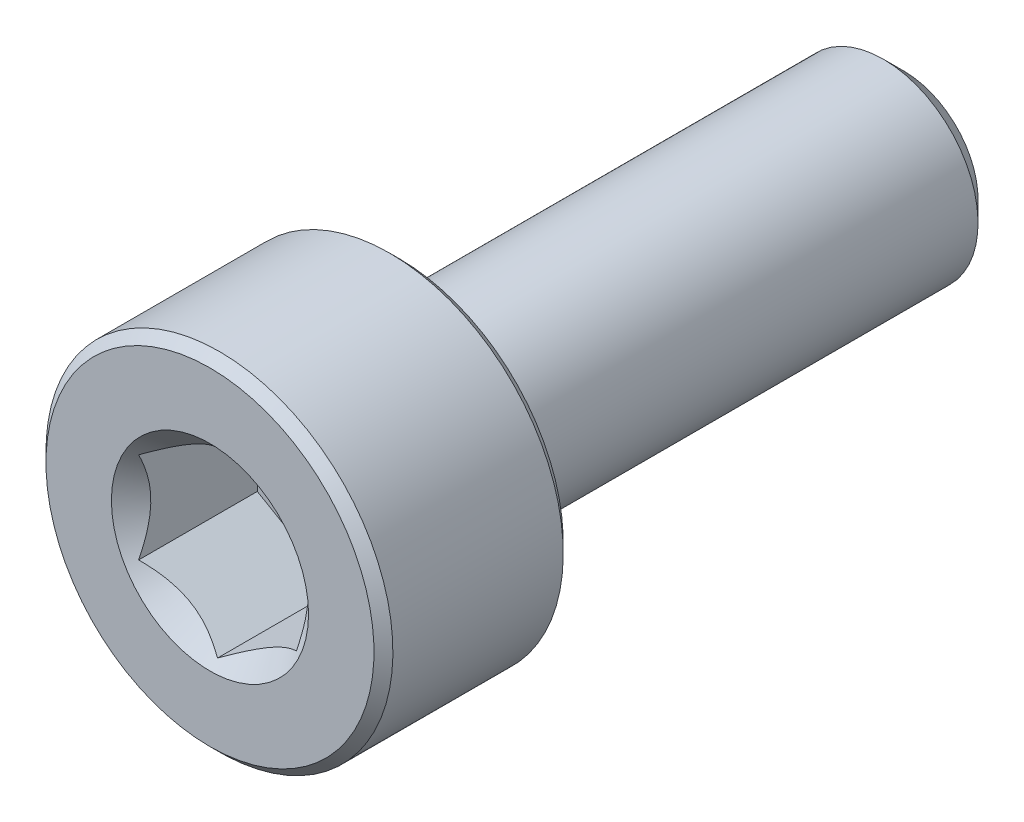
ISO-10303-21;
HEADER;
FILE_DESCRIPTION(('STEP AP214'),'2;1');
FILE_NAME('part.step','',(''),(''),'','','');
FILE_SCHEMA(('AUTOMOTIVE_DESIGN { 1 0 10303 214 1 1 1 1 }'));
ENDSEC;
DATA;
#1=APPLICATION_CONTEXT('core data for automotive mechanical design processes');
#2=APPLICATION_PROTOCOL_DEFINITION('international standard','automotive_design',2000,#1);
#3=PRODUCT_CONTEXT('',#1,'mechanical');
#4=PRODUCT('Part','Part','',(#3));
#5=PRODUCT_RELATED_PRODUCT_CATEGORY('part','',(#4));
#6=PRODUCT_DEFINITION_FORMATION('','',#4);
#7=PRODUCT_DEFINITION_CONTEXT('part definition',#1,'design');
#8=PRODUCT_DEFINITION('design','',#6,#7);
#9=PRODUCT_DEFINITION_SHAPE('','',#8);
#10=(LENGTH_UNIT() NAMED_UNIT(*) SI_UNIT(.MILLI.,.METRE.));
#11=(NAMED_UNIT(*) PLANE_ANGLE_UNIT() SI_UNIT($,.RADIAN.));
#12=(NAMED_UNIT(*) SI_UNIT($,.STERADIAN.) SOLID_ANGLE_UNIT());
#13=UNCERTAINTY_MEASURE_WITH_UNIT(LENGTH_MEASURE(1.E-05),#10,'distance_accuracy_value','');
#14=(GEOMETRIC_REPRESENTATION_CONTEXT(3) GLOBAL_UNCERTAINTY_ASSIGNED_CONTEXT((#13)) GLOBAL_UNIT_ASSIGNED_CONTEXT((#10,
#11,#12)) REPRESENTATION_CONTEXT('',''));
#15=CARTESIAN_POINT('',(0.,0.,0.));
#16=DIRECTION('',(0.,0.,1.));
#17=DIRECTION('',(1.,0.,0.));
#18=AXIS2_PLACEMENT_3D('',#15,#16,#17);
#19=CARTESIAN_POINT('',(0.,1.17524047358084,-5.5));
#20=DIRECTION('',(0.,0.,-1.));
#21=DIRECTION('',(0.,1.,0.));
#22=AXIS2_PLACEMENT_3D('',#19,#20,#21);
#23=PLANE('',#22);
#24=CARTESIAN_POINT('',(0.,0.,-5.5));
#25=DIRECTION('',(0.,0.,-1.));
#26=DIRECTION('',(0.,1.,0.));
#27=AXIS2_PLACEMENT_3D('',#24,#25,#26);
#28=CIRCLE('',#27,1.17524047358084);
#29=CARTESIAN_POINT('',(0.,1.17524047358084,-5.5));
#30=VERTEX_POINT('',#29);
#31=EDGE_CURVE('E52',#30,#30,#28,.T.);
#32=ORIENTED_EDGE('',*,*,#31,.T.);
#33=EDGE_LOOP('',(#32));
#34=FACE_BOUND('',#33,.T.);
#35=ADVANCED_FACE('F39',(#34),#23,.T.);
#36=CARTESIAN_POINT('',(0.,0.,-5.5));
#37=DIRECTION('',(0.,0.,1.));
#38=DIRECTION('',(0.,-1.,0.));
#39=AXIS2_PLACEMENT_3D('',#36,#37,#38);
#40=CONICAL_SURFACE('',#39,1.17524047358084,0.785398163397445);
#41=CARTESIAN_POINT('',(0.,0.,-5.17524047358083));
#42=DIRECTION('',(0.,0.,-1.));
#43=DIRECTION('',(0.,1.,0.));
#44=AXIS2_PLACEMENT_3D('',#41,#42,#43);
#45=CIRCLE('',#44,1.5);
#46=CARTESIAN_POINT('',(0.,1.5,-5.17524047358083));
#47=VERTEX_POINT('',#46);
#48=EDGE_CURVE('E155',#47,#47,#45,.T.);
#49=ORIENTED_EDGE('',*,*,#48,.T.);
#50=EDGE_LOOP('',(#49));
#51=FACE_BOUND('',#50,.T.);
#52=ORIENTED_EDGE('',*,*,#31,.F.);
#53=EDGE_LOOP('',(#52));
#54=FACE_BOUND('',#53,.T.);
#55=ADVANCED_FACE('F161',(#51,#54),#40,.T.);
#56=CARTESIAN_POINT('',(0.,0.,-5.5));
#57=DIRECTION('',(0.,0.,-1.));
#58=DIRECTION('',(0.,1.,0.));
#59=AXIS2_PLACEMENT_3D('',#56,#57,#58);
#60=CYLINDRICAL_SURFACE('',#59,1.5);
#61=CARTESIAN_POINT('',(0.,0.,2.35));
#62=DIRECTION('',(0.,0.,-1.));
#63=DIRECTION('',(0.,1.,0.));
#64=AXIS2_PLACEMENT_3D('',#61,#62,#63);
#65=CIRCLE('',#64,1.5);
#66=CARTESIAN_POINT('',(0.,1.5,2.35));
#67=VERTEX_POINT('',#66);
#68=EDGE_CURVE('E152',#67,#67,#65,.T.);
#69=ORIENTED_EDGE('',*,*,#68,.T.);
#70=EDGE_LOOP('',(#69));
#71=FACE_BOUND('',#70,.T.);
#72=ORIENTED_EDGE('',*,*,#48,.F.);
#73=EDGE_LOOP('',(#72));
#74=FACE_BOUND('',#73,.T.);
#75=ADVANCED_FACE('F163',(#71,#74),#60,.T.);
#76=CARTESIAN_POINT('',(0.,0.,2.35));
#77=DIRECTION('',(0.,0.,-1.));
#78=DIRECTION('',(0.,1.,0.));
#79=AXIS2_PLACEMENT_3D('',#76,#77,#78);
#80=TOROIDAL_SURFACE('',#79,1.65,0.15);
#81=CARTESIAN_POINT('',(0.,0.,2.5));
#82=DIRECTION('',(0.,0.,-1.));
#83=DIRECTION('',(0.,1.,0.));
#84=AXIS2_PLACEMENT_3D('',#81,#82,#83);
#85=CIRCLE('',#84,1.65);
#86=CARTESIAN_POINT('',(0.,1.65,2.5));
#87=VERTEX_POINT('',#86);
#88=EDGE_CURVE('E149',#87,#87,#85,.T.);
#89=ORIENTED_EDGE('',*,*,#88,.T.);
#90=EDGE_LOOP('',(#89));
#91=FACE_BOUND('',#90,.T.);
#92=ORIENTED_EDGE('',*,*,#68,.F.);
#93=EDGE_LOOP('',(#92));
#94=FACE_BOUND('',#93,.T.);
#95=ADVANCED_FACE('F169',(#91,#94),#80,.F.);
#96=CARTESIAN_POINT('',(0.,2.6,2.5));
#97=DIRECTION('',(0.,0.,-1.));
#98=DIRECTION('',(0.,1.,0.));
#99=AXIS2_PLACEMENT_3D('',#96,#97,#98);
#100=PLANE('',#99);
#101=CARTESIAN_POINT('',(0.,0.,2.5));
#102=DIRECTION('',(0.,0.,-1.));
#103=DIRECTION('',(0.,1.,0.));
#104=AXIS2_PLACEMENT_3D('',#101,#102,#103);
#105=CIRCLE('',#104,2.6);
#106=CARTESIAN_POINT('',(0.,2.6,2.5));
#107=VERTEX_POINT('',#106);
#108=EDGE_CURVE('E146',#107,#107,#105,.T.);
#109=ORIENTED_EDGE('',*,*,#108,.T.);
#110=EDGE_LOOP('',(#109));
#111=FACE_BOUND('',#110,.T.);
#112=ORIENTED_EDGE('',*,*,#88,.F.);
#113=EDGE_LOOP('',(#112));
#114=FACE_BOUND('',#113,.T.);
#115=ADVANCED_FACE('F175',(#111,#114),#100,.T.);
#116=CARTESIAN_POINT('',(0.,0.,2.5));
#117=DIRECTION('',(0.,0.,1.));
#118=DIRECTION('',(0.,-1.,0.));
#119=AXIS2_PLACEMENT_3D('',#116,#117,#118);
#120=CONICAL_SURFACE('',#119,2.6,0.785398163397445);
#121=CARTESIAN_POINT('',(0.,0.,2.65));
#122=DIRECTION('',(0.,0.,-1.));
#123=DIRECTION('',(0.,1.,0.));
#124=AXIS2_PLACEMENT_3D('',#121,#122,#123);
#125=CIRCLE('',#124,2.75);
#126=CARTESIAN_POINT('',(0.,2.75,2.65));
#127=VERTEX_POINT('',#126);
#128=EDGE_CURVE('E143',#127,#127,#125,.T.);
#129=ORIENTED_EDGE('',*,*,#128,.T.);
#130=EDGE_LOOP('',(#129));
#131=FACE_BOUND('',#130,.T.);
#132=ORIENTED_EDGE('',*,*,#108,.F.);
#133=EDGE_LOOP('',(#132));
#134=FACE_BOUND('',#133,.T.);
#135=ADVANCED_FACE('F179',(#131,#134),#120,.T.);
#136=CARTESIAN_POINT('',(0.,0.,-5.5));
#137=DIRECTION('',(0.,0.,-1.));
#138=DIRECTION('',(0.,1.,0.));
#139=AXIS2_PLACEMENT_3D('',#136,#137,#138);
#140=CYLINDRICAL_SURFACE('',#139,2.75);
#141=CARTESIAN_POINT('',(0.,0.,5.35));
#142=DIRECTION('',(0.,0.,-1.));
#143=DIRECTION('',(0.,1.,0.));
#144=AXIS2_PLACEMENT_3D('',#141,#142,#143);
#145=CIRCLE('',#144,2.75);
#146=CARTESIAN_POINT('',(0.,2.75,5.35));
#147=VERTEX_POINT('',#146);
#148=EDGE_CURVE('E140',#147,#147,#145,.T.);
#149=ORIENTED_EDGE('',*,*,#148,.T.);
#150=EDGE_LOOP('',(#149));
#151=FACE_BOUND('',#150,.T.);
#152=ORIENTED_EDGE('',*,*,#128,.F.);
#153=EDGE_LOOP('',(#152));
#154=FACE_BOUND('',#153,.T.);
#155=ADVANCED_FACE('F183',(#151,#154),#140,.T.);
#156=CARTESIAN_POINT('',(0.,0.,5.35));
#157=DIRECTION('',(0.,0.,-1.));
#158=DIRECTION('',(0.,1.,0.));
#159=AXIS2_PLACEMENT_3D('',#156,#157,#158);
#160=CONICAL_SURFACE('',#159,2.75,0.785398163397451);
#161=CARTESIAN_POINT('',(0.,0.,5.5));
#162=DIRECTION('',(0.,0.,-1.));
#163=DIRECTION('',(0.,1.,0.));
#164=AXIS2_PLACEMENT_3D('',#161,#162,#163);
#165=CIRCLE('',#164,2.6);
#166=CARTESIAN_POINT('',(0.,2.6,5.5));
#167=VERTEX_POINT('',#166);
#168=EDGE_CURVE('E137',#167,#167,#165,.T.);
#169=ORIENTED_EDGE('',*,*,#168,.T.);
#170=EDGE_LOOP('',(#169));
#171=FACE_BOUND('',#170,.T.);
#172=ORIENTED_EDGE('',*,*,#148,.F.);
#173=EDGE_LOOP('',(#172));
#174=FACE_BOUND('',#173,.T.);
#175=ADVANCED_FACE('F187',(#171,#174),#160,.T.);
#176=CARTESIAN_POINT('',(0.,0.,5.5));
#177=DIRECTION('',(0.,0.,1.));
#178=DIRECTION('',(0.,-1.,0.));
#179=AXIS2_PLACEMENT_3D('',#176,#177,#178);
#180=PLANE('',#179);
#181=CARTESIAN_POINT('',(0.,0.,5.5));
#182=DIRECTION('',(0.,0.,1.));
#183=DIRECTION('',(1.,0.,0.));
#184=AXIS2_PLACEMENT_3D('',#181,#182,#183);
#185=CIRCLE('',#184,1.5625);
#186=CARTESIAN_POINT('',(1.5625,0.,5.5));
#187=VERTEX_POINT('',#186);
#188=EDGE_CURVE('E111',#187,#187,#185,.T.);
#189=ORIENTED_EDGE('',*,*,#188,.F.);
#190=EDGE_LOOP('',(#189));
#191=FACE_BOUND('',#190,.T.);
#192=ORIENTED_EDGE('',*,*,#168,.F.);
#193=EDGE_LOOP('',(#192));
#194=FACE_BOUND('',#193,.T.);
#195=ADVANCED_FACE('F191',(#191,#194),#180,.T.);
#196=CARTESIAN_POINT('',(0.,0.,5.5));
#197=DIRECTION('',(0.,0.,1.));
#198=DIRECTION('',(1.,0.,0.));
#199=AXIS2_PLACEMENT_3D('',#196,#197,#198);
#200=CONICAL_SURFACE('',#199,1.5625,0.78539816339745);
#201=ORIENTED_EDGE('',*,*,#188,.T.);
#202=EDGE_LOOP('',(#201));
#203=FACE_BOUND('',#202,.T.);
#204=CARTESIAN_POINT('',(-0.000200000000000281,-1.4434911430279,5.3809911568832));
#205=CARTESIAN_POINT('',(0.0427751670715865,-1.41867941875065,5.35619734102917));
#206=CARTESIAN_POINT('',(0.0864690047459478,-1.39345276980743,5.33285940739275));
#207=CARTESIAN_POINT('',(0.175565930841942,-1.34201263554194,5.2901276770586));
#208=CARTESIAN_POINT('',(0.220977498357064,-1.31579425481276,5.27075766533448));
#209=CARTESIAN_POINT('',(0.31254782093526,-1.26292610442246,5.23757615638754));
#210=CARTESIAN_POINT('',(0.358683240175885,-1.23628980770471,5.22368123202672));
#211=CARTESIAN_POINT('',(0.451970080407592,-1.18243062538508,5.2022729551347));
#212=CARTESIAN_POINT('',(0.49911864913638,-1.15520938653761,5.19474361454085));
#213=CARTESIAN_POINT('',(0.580373556887252,-1.10829684367467,5.18795017102477));
#214=CARTESIAN_POINT('',(0.614374876627941,-1.08866617256958,5.18694423207841));
#215=CARTESIAN_POINT('',(0.682317764432477,-1.04943932800611,5.18863708788538));
#216=CARTESIAN_POINT('',(0.716259317655657,-1.02984316311599,5.1913367001896));
#217=CARTESIAN_POINT('',(0.783814856457499,-0.990839954603499,5.20028460329044));
#218=CARTESIAN_POINT('',(0.817428507286775,-0.971433104248771,5.20653619887377));
#219=CARTESIAN_POINT('',(0.884094638217813,-0.932943395609905,5.22225135438797));
#220=CARTESIAN_POINT('',(0.917146871030295,-0.9138606800983,5.23171629306152));
#221=CARTESIAN_POINT('',(1.00179969160026,-0.864986351354568,5.25980706366165));
#222=CARTESIAN_POINT('',(1.05286649242964,-0.835502920149076,5.28054583042626));
#223=CARTESIAN_POINT('',(1.15300085411325,-0.777690319475908,5.32726280764554));
#224=CARTESIAN_POINT('',(1.20207431157827,-0.749357745598416,5.35322396892083));
#225=CARTESIAN_POINT('',(1.2502,-0.721572366433194,5.3809911568832));
#226=B_SPLINE_CURVE_WITH_KNOTS('',3,(#204,#205,#206,#207,#208,#209,#210,#211,#212,#213,#214,
#215,#216,#217,#218,#219,#220,#221,#222,#223,#224,#225),.UNSPECIFIED.,.F.,.F.,(4,2,2,2,2,2,2,2,
2,2,4),(0.,0.166533409618304,0.334037607289762,0.498880396489698,0.663307919240275,
0.780963963458827,0.898645970148453,1.01643764860773,1.13427993171549,1.32148652032141,
1.50809158792574),.UNSPECIFIED.);
#227=CARTESIAN_POINT('',(0.,-1.44337567297406,5.38087567297406));
#228=VERTEX_POINT('',#227);
#229=CARTESIAN_POINT('',(1.25,-0.721687836487032,5.38087567297406));
#230=VERTEX_POINT('',#229);
#231=EDGE_CURVE('E12',#228,#230,#226,.T.);
#232=ORIENTED_EDGE('',*,*,#231,.F.);
#233=CARTESIAN_POINT('',(-1.2502,-0.721572366433195,5.3809911568832));
#234=CARTESIAN_POINT('',(-1.20722483292841,-0.746384090710444,5.35619734102917));
#235=CARTESIAN_POINT('',(-1.16353099525405,-0.771610739653665,5.33285940739275));
#236=CARTESIAN_POINT('',(-1.07443406915806,-0.823050873919155,5.2901276770586));
#237=CARTESIAN_POINT('',(-1.02902250164294,-0.849269254648333,5.27075766533448));
#238=CARTESIAN_POINT('',(-0.937452179064741,-0.902137405038636,5.23757615638754));
#239=CARTESIAN_POINT('',(-0.891316759824115,-0.928773701756387,5.22368123202672));
#240=CARTESIAN_POINT('',(-0.798029919592408,-0.982632884076013,5.2022729551347));
#241=CARTESIAN_POINT('',(-0.750881350863621,-1.00985412292348,5.19474361454085));
#242=CARTESIAN_POINT('',(-0.669626443112748,-1.05676666578643,5.18795017102477));
#243=CARTESIAN_POINT('',(-0.63562512337206,-1.07639733689152,5.18694423207841));
#244=CARTESIAN_POINT('',(-0.567682235567523,-1.11562418145499,5.18863708788538));
#245=CARTESIAN_POINT('',(-0.533740682344343,-1.1352203463451,5.1913367001896));
#246=CARTESIAN_POINT('',(-0.466185143542501,-1.1742235548576,5.20028460329044));
#247=CARTESIAN_POINT('',(-0.432571492713226,-1.19363040521233,5.20653619887377));
#248=CARTESIAN_POINT('',(-0.365905361782188,-1.23212011385119,5.22225135438797));
#249=CARTESIAN_POINT('',(-0.332853128969705,-1.2512028293628,5.23171629306152));
#250=CARTESIAN_POINT('',(-0.248200308399736,-1.30007715810653,5.25980706366165));
#251=CARTESIAN_POINT('',(-0.197133507570362,-1.32956058931202,5.28054583042626));
#252=CARTESIAN_POINT('',(-0.0969991458867454,-1.38737318998519,5.32726280764554));
#253=CARTESIAN_POINT('',(-0.0479256884217308,-1.41570576386268,5.35322396892083));
#254=CARTESIAN_POINT('',(0.00019999999999975,-1.4434911430279,5.3809911568832));
#255=B_SPLINE_CURVE_WITH_KNOTS('',3,(#233,#234,#235,#236,#237,#238,#239,#240,#241,#242,#243,
#244,#245,#246,#247,#248,#249,#250,#251,#252,#253,#254),.UNSPECIFIED.,.F.,.F.,(4,2,2,2,2,2,2,2,
2,2,4),(0.,0.166533409618304,0.334037607289761,0.498880396489698,0.663307919240274,
0.780963963458826,0.898645970148453,1.01643764860773,1.13427993171549,1.32148652032141,
1.50809158792574),.UNSPECIFIED.);
#256=CARTESIAN_POINT('',(-1.25,-0.721687836487033,5.38087567297406));
#257=VERTEX_POINT('',#256);
#258=EDGE_CURVE('E97',#257,#228,#255,.T.);
#259=ORIENTED_EDGE('',*,*,#258,.F.);
#260=CARTESIAN_POINT('',(-1.25,-1.52906039618109,5.91247485937656));
#261=CARTESIAN_POINT('',(-1.25,-1.49220529080579,5.88394520440545));
#262=CARTESIAN_POINT('',(-1.25,-1.45515496684494,5.85566856788859));
#263=CARTESIAN_POINT('',(-1.25,-1.38058140838662,5.79972834081338));
#264=CARTESIAN_POINT('',(-1.25,-1.34305806621138,5.77206489394419));
#265=CARTESIAN_POINT('',(-1.25,-1.22910675079842,5.68976023403817));
#266=CARTESIAN_POINT('',(-1.25,-1.15185483124782,5.63624146268623));
#267=CARTESIAN_POINT('',(-1.25,-0.989252377816229,5.53031168703531));
#268=CARTESIAN_POINT('',(-1.25,-0.903702856150537,5.47820301658352));
#269=CARTESIAN_POINT('',(-1.25,-0.728224302589145,5.38229295817095));
#270=CARTESIAN_POINT('',(-1.25,-0.638311408271526,5.33846351429438));
#271=CARTESIAN_POINT('',(-1.25,-0.504179528176993,5.28481796944124));
#272=CARTESIAN_POINT('',(-1.25,-0.462140309604462,5.26958311655924));
#273=CARTESIAN_POINT('',(-1.25,-0.376968358930112,5.24248027967488));
#274=CARTESIAN_POINT('',(-1.25,-0.333835559023206,5.23061250499961));
#275=CARTESIAN_POINT('',(-1.25,-0.247500786382209,5.21108793058395));
#276=CARTESIAN_POINT('',(-1.25,-0.204316746020218,5.20335314062603));
#277=CARTESIAN_POINT('',(-1.25,-0.117386820033729,5.19226051149026));
#278=CARTESIAN_POINT('',(-1.25,-0.0736410606163111,5.18890170591012));
#279=CARTESIAN_POINT('',(-1.25,0.0119255032765034,5.18685912442193));
#280=CARTESIAN_POINT('',(-1.25,0.0537413250189258,5.18796541806101));
#281=CARTESIAN_POINT('',(-1.25,0.137056635467402,5.19430478308355));
#282=CARTESIAN_POINT('',(-1.25,0.178556095869134,5.19953821944028));
#283=CARTESIAN_POINT('',(-1.25,0.261643418190125,5.21392095567135));
#284=CARTESIAN_POINT('',(-1.25,0.303218962688244,5.22314026055592));
#285=CARTESIAN_POINT('',(-1.25,0.385447906554256,5.24497795035777));
#286=CARTESIAN_POINT('',(-1.25,0.426101349364106,5.25759617478337));
#287=CARTESIAN_POINT('',(-1.25,0.550318756100951,5.30099995648882));
#288=CARTESIAN_POINT('',(-1.25,0.63220691381951,5.33656592610618));
#289=CARTESIAN_POINT('',(-1.25,0.792163832901716,5.41573000476451));
#290=CARTESIAN_POINT('',(-1.25,0.870217968244436,5.45935624183847));
#291=CARTESIAN_POINT('',(-1.25,1.01943092253057,5.54945332591182));
#292=CARTESIAN_POINT('',(-1.25,1.09074002929844,5.59567842626371));
#293=CARTESIAN_POINT('',(-1.25,1.19579897437392,5.66717891685916));
#294=CARTESIAN_POINT('',(-1.25,1.23036719648395,5.69127266485707));
#295=CARTESIAN_POINT('',(-1.25,1.29902897795883,5.74010822093429));
#296=CARTESIAN_POINT('',(-1.25,1.33312266558282,5.7648498484799));
#297=CARTESIAN_POINT('',(-1.25,1.36701837723592,5.78986045188314));
#298=B_SPLINE_CURVE_WITH_KNOTS('',3,(#260,#261,#262,#263,#264,#265,#266,#267,#268,#269,#270,
#271,#272,#273,#274,#275,#276,#277,#278,#279,#280,#281,#282,#283,#284,#285,#286,#287,#288,#289,
#290,#291,#292,#293,#294,#295,#296,#297),.UNSPECIFIED.,.F.,.F.,(4,2,2,2,2,2,2,2,2,2,2,2,2,2,2,2,
2,2,4),(0.,0.139818578617195,0.279669581865359,0.561494750208466,0.861785235472756,
1.16103911347106,1.2950714169747,1.42911205127607,1.56052497981098,1.69190888189515,
1.81718933044287,1.94248085908789,2.0700684972633,2.19765011200548,2.46470732734004,
2.73271472961998,2.98752909358604,3.11393310607498,3.24030226282948),.UNSPECIFIED.);
#299=CARTESIAN_POINT('',(-1.25,0.721687836487033,5.38087567297406));
#300=VERTEX_POINT('',#299);
#301=EDGE_CURVE('E110',#300,#257,#298,.F.);
#302=ORIENTED_EDGE('',*,*,#301,.F.);
#303=CARTESIAN_POINT('',(0.000199999999999643,1.4434911430279,5.3809911568832));
#304=CARTESIAN_POINT('',(-0.042775167071587,1.41867941875065,5.35619734102917));
#305=CARTESIAN_POINT('',(-0.0864690047459482,1.39345276980743,5.33285940739275));
#306=CARTESIAN_POINT('',(-0.175565930841942,1.34201263554194,5.2901276770586));
#307=CARTESIAN_POINT('',(-0.220977498357064,1.31579425481276,5.27075766533448));
#308=CARTESIAN_POINT('',(-0.312547820935259,1.26292610442246,5.23757615638754));
#309=CARTESIAN_POINT('',(-0.358683240175885,1.23628980770471,5.22368123202672));
#310=CARTESIAN_POINT('',(-0.451970080407592,1.18243062538509,5.2022729551347));
#311=CARTESIAN_POINT('',(-0.499118649136379,1.15520938653761,5.19474361454085));
#312=CARTESIAN_POINT('',(-0.580373556887252,1.10829684367467,5.18795017102477));
#313=CARTESIAN_POINT('',(-0.61437487662794,1.08866617256958,5.18694423207842));
#314=CARTESIAN_POINT('',(-0.682317764432477,1.04943932800611,5.18863708788538));
#315=CARTESIAN_POINT('',(-0.716259317655657,1.02984316311599,5.1913367001896));
#316=CARTESIAN_POINT('',(-0.783814856457499,0.9908399546035,5.20028460329044));
#317=CARTESIAN_POINT('',(-0.817428507286775,0.971433104248772,5.20653619887377));
#318=CARTESIAN_POINT('',(-0.884094638217813,0.932943395609906,5.22225135438797));
#319=CARTESIAN_POINT('',(-0.917146871030295,0.913860680098301,5.23171629306152));
#320=CARTESIAN_POINT('',(-1.00179969160026,0.864986351354569,5.25980706366165));
#321=CARTESIAN_POINT('',(-1.05286649242964,0.835502920149077,5.28054583042627));
#322=CARTESIAN_POINT('',(-1.15300085411325,0.777690319475909,5.32726280764554));
#323=CARTESIAN_POINT('',(-1.20207431157827,0.749357745598417,5.35322396892083));
#324=CARTESIAN_POINT('',(-1.2502,0.721572366433195,5.3809911568832));
#325=B_SPLINE_CURVE_WITH_KNOTS('',3,(#303,#304,#305,#306,#307,#308,#309,#310,#311,#312,#313,
#314,#315,#316,#317,#318,#319,#320,#321,#322,#323,#324),.UNSPECIFIED.,.F.,.F.,(4,2,2,2,2,2,2,2,
2,2,4),(0.,0.166533409618303,0.334037607289761,0.498880396489697,0.663307919240273,
0.780963963458826,0.898645970148452,1.01643764860773,1.13427993171549,1.32148652032141,
1.50809158792573),.UNSPECIFIED.);
#326=CARTESIAN_POINT('',(0.,1.44337567297407,5.38087567297406));
#327=VERTEX_POINT('',#326);
#328=EDGE_CURVE('E241',#327,#300,#325,.T.);
#329=ORIENTED_EDGE('',*,*,#328,.F.);
#330=CARTESIAN_POINT('',(1.2502,0.721572366433195,5.3809911568832));
#331=CARTESIAN_POINT('',(1.20722483292841,0.746384090710445,5.35619734102917));
#332=CARTESIAN_POINT('',(1.16353099525405,0.771610739653665,5.33285940739275));
#333=CARTESIAN_POINT('',(1.07443406915806,0.823050873919156,5.2901276770586));
#334=CARTESIAN_POINT('',(1.02902250164294,0.849269254648334,5.27075766533448));
#335=CARTESIAN_POINT('',(0.93745217906474,0.902137405038636,5.23757615638754));
#336=CARTESIAN_POINT('',(0.891316759824114,0.928773701756388,5.22368123202672));
#337=CARTESIAN_POINT('',(0.798029919592408,0.982632884076013,5.2022729551347));
#338=CARTESIAN_POINT('',(0.75088135086362,1.00985412292348,5.19474361454085));
#339=CARTESIAN_POINT('',(0.669626443112748,1.05676666578643,5.18795017102477));
#340=CARTESIAN_POINT('',(0.635625123372059,1.07639733689152,5.18694423207842));
#341=CARTESIAN_POINT('',(0.567682235567523,1.11562418145499,5.18863708788538));
#342=CARTESIAN_POINT('',(0.533740682344343,1.1352203463451,5.1913367001896));
#343=CARTESIAN_POINT('',(0.466185143542501,1.1742235548576,5.20028460329044));
#344=CARTESIAN_POINT('',(0.432571492713225,1.19363040521233,5.20653619887377));
#345=CARTESIAN_POINT('',(0.365905361782187,1.23212011385119,5.22225135438797));
#346=CARTESIAN_POINT('',(0.332853128969705,1.2512028293628,5.23171629306152));
#347=CARTESIAN_POINT('',(0.248200308399736,1.30007715810653,5.25980706366165));
#348=CARTESIAN_POINT('',(0.197133507570362,1.32956058931202,5.28054583042627));
#349=CARTESIAN_POINT('',(0.096999145886745,1.38737318998519,5.32726280764554));
#350=CARTESIAN_POINT('',(0.0479256884217303,1.41570576386268,5.35322396892083));
#351=CARTESIAN_POINT('',(-0.000200000000000256,1.4434911430279,5.3809911568832));
#352=B_SPLINE_CURVE_WITH_KNOTS('',3,(#330,#331,#332,#333,#334,#335,#336,#337,#338,#339,#340,
#341,#342,#343,#344,#345,#346,#347,#348,#349,#350,#351),.UNSPECIFIED.,.F.,.F.,(4,2,2,2,2,2,2,2,
2,2,4),(0.,0.166533409618303,0.334037607289761,0.498880396489697,0.663307919240274,
0.780963963458826,0.898645970148452,1.01643764860773,1.13427993171549,1.32148652032141,
1.50809158792573),.UNSPECIFIED.);
#353=CARTESIAN_POINT('',(1.25,0.721687836487033,5.38087567297406));
#354=VERTEX_POINT('',#353);
#355=EDGE_CURVE('E214',#354,#327,#352,.T.);
#356=ORIENTED_EDGE('',*,*,#355,.F.);
#357=CARTESIAN_POINT('',(1.25,-1.52905951307294,5.91247417565872));
#358=CARTESIAN_POINT('',(1.25,-1.49220443340975,5.88394454719035));
#359=CARTESIAN_POINT('',(1.25,-1.45515413523639,5.85566793713426));
#360=CARTESIAN_POINT('',(1.25,-1.38058062859442,5.79972776283032));
#361=CARTESIAN_POINT('',(1.25,-1.34305731244813,5.77206434227156));
#362=CARTESIAN_POINT('',(1.25,-1.22910607665359,5.68975976182298));
#363=CARTESIAN_POINT('',(1.25,-1.15185421119604,5.63624104323767));
#364=CARTESIAN_POINT('',(1.25,-0.98925187584104,5.53031137662917));
#365=CARTESIAN_POINT('',(1.25,-0.903702418475842,5.47820276205999));
#366=CARTESIAN_POINT('',(1.25,-0.72822399892133,5.38229280746302));
#367=CARTESIAN_POINT('',(1.25,-0.638311174264586,5.33846341158793));
#368=CARTESIAN_POINT('',(1.25,-0.504179346124884,5.28481790068269));
#369=CARTESIAN_POINT('',(1.25,-0.462140104878465,5.26958304479528));
#370=CARTESIAN_POINT('',(1.25,-0.376968107935322,5.24248020642936));
#371=CARTESIAN_POINT('',(1.25,-0.333835284434423,5.23061243327523));
#372=CARTESIAN_POINT('',(1.25,-0.247500465304423,5.21108786739434));
#373=CARTESIAN_POINT('',(1.25,-0.204316402067131,5.20335308428999));
#374=CARTESIAN_POINT('',(1.25,-0.117386430899383,5.19226047426313));
#375=CARTESIAN_POINT('',(1.25,-0.0736406491759952,5.1889016809363));
#376=CARTESIAN_POINT('',(1.25,0.0119259518544277,5.18685912816713));
#377=CARTESIAN_POINT('',(1.25,0.053741788486036,5.18796543755722));
#378=CARTESIAN_POINT('',(1.25,0.137057126970277,5.1943048362587));
#379=CARTESIAN_POINT('',(1.25,0.178556600518281,5.19953829054549));
#380=CARTESIAN_POINT('',(1.25,0.261643948783009,5.21392106408937));
#381=CARTESIAN_POINT('',(1.25,0.303219506029026,5.22314038847805));
#382=CARTESIAN_POINT('',(1.25,0.385448473975618,5.2449781174263));
#383=CARTESIAN_POINT('',(1.25,0.426101928118348,5.2575963614937));
#384=CARTESIAN_POINT('',(1.25,0.550319456992717,5.30100023399784));
#385=CARTESIAN_POINT('',(1.25,0.632207719380867,5.33656628684844));
#386=CARTESIAN_POINT('',(1.25,0.792164839741488,5.41573054123008));
#387=CARTESIAN_POINT('',(1.25,0.8702190716438,5.45935687085997));
#388=CARTESIAN_POINT('',(1.25,1.01943219916295,5.54945413200827));
#389=CARTESIAN_POINT('',(1.25,1.09074138323722,5.59567931603778));
#390=CARTESIAN_POINT('',(1.25,1.19580044259576,5.66717993171419));
#391=CARTESIAN_POINT('',(1.25,1.23036870224718,5.69127372107415));
#392=CARTESIAN_POINT('',(1.25,1.29903055855592,5.74010935982246));
#393=CARTESIAN_POINT('',(1.25,1.33312428347233,5.76485102867727));
#394=CARTESIAN_POINT('',(1.25,1.36702003234981,5.78986167333641));
#395=B_SPLINE_CURVE_WITH_KNOTS('',3,(#357,#358,#359,#360,#361,#362,#363,#364,#365,#366,#367,
#368,#369,#370,#371,#372,#373,#374,#375,#376,#377,#378,#379,#380,#381,#382,#383,#384,#385,#386,
#387,#388,#389,#390,#391,#392,#393,#394),.UNSPECIFIED.,.F.,.F.,(4,2,2,2,2,2,2,2,2,2,2,2,2,2,2,2,
2,2,4),(0.,0.139818468955544,0.279669362509984,0.561494307361431,0.86178454072842,
1.1610381692749,1.29507053957457,1.42911124055678,1.56052423261168,1.69190819817627,
1.8171886924228,1.94248026682952,2.07006795499489,2.19764961970651,2.4647072208394,
2.73271501145679,2.98752970662837,3.11393388247469,3.24030320257251),.UNSPECIFIED.);
#396=EDGE_CURVE('E59',#230,#354,#395,.T.);
#397=ORIENTED_EDGE('',*,*,#396,.F.);
#398=EDGE_LOOP('',(#232,#259,#302,#329,#356,#397));
#399=FACE_BOUND('',#398,.T.);
#400=ADVANCED_FACE('F96',(#203,#399),#200,.F.);
#401=CARTESIAN_POINT('',(0.,2.6,3.5));
#402=DIRECTION('',(0.,0.,-1.));
#403=DIRECTION('',(0.,1.,0.));
#404=AXIS2_PLACEMENT_3D('',#401,#402,#403);
#405=PLANE('',#404);
#406=DIRECTION('',(0.866025403784439,0.5,0.));
#407=VECTOR('',#406,1.);
#408=CARTESIAN_POINT('',(0.,-1.44337567297406,3.5));
#409=LINE('',#408,#407);
#410=CARTESIAN_POINT('',(0.,-1.44337567297406,3.5));
#411=VERTEX_POINT('',#410);
#412=CARTESIAN_POINT('',(1.25,-0.721687836487032,3.5));
#413=VERTEX_POINT('',#412);
#414=EDGE_CURVE('E114',#411,#413,#409,.T.);
#415=ORIENTED_EDGE('',*,*,#414,.T.);
#416=DIRECTION('',(0.,1.,0.));
#417=VECTOR('',#416,1.);
#418=CARTESIAN_POINT('',(1.25,-0.721687836487032,3.5));
#419=LINE('',#418,#417);
#420=CARTESIAN_POINT('',(1.25,0.721687836487033,3.5));
#421=VERTEX_POINT('',#420);
#422=EDGE_CURVE('E66',#413,#421,#419,.T.);
#423=ORIENTED_EDGE('',*,*,#422,.T.);
#424=DIRECTION('',(-0.866025403784439,0.5,0.));
#425=VECTOR('',#424,1.);
#426=CARTESIAN_POINT('',(1.25,0.721687836487033,3.5));
#427=LINE('',#426,#425);
#428=CARTESIAN_POINT('',(0.,1.44337567297407,3.5));
#429=VERTEX_POINT('',#428);
#430=EDGE_CURVE('E122',#421,#429,#427,.T.);
#431=ORIENTED_EDGE('',*,*,#430,.T.);
#432=DIRECTION('',(-0.866025403784439,-0.5,0.));
#433=VECTOR('',#432,1.);
#434=CARTESIAN_POINT('',(0.,1.44337567297407,3.5));
#435=LINE('',#434,#433);
#436=CARTESIAN_POINT('',(-1.25,0.721687836487033,3.5));
#437=VERTEX_POINT('',#436);
#438=EDGE_CURVE('E129',#429,#437,#435,.T.);
#439=ORIENTED_EDGE('',*,*,#438,.T.);
#440=DIRECTION('',(0.,-1.,0.));
#441=VECTOR('',#440,1.);
#442=CARTESIAN_POINT('',(-1.25,0.721687836487033,3.5));
#443=LINE('',#442,#441);
#444=CARTESIAN_POINT('',(-1.25,-0.721687836487033,3.5));
#445=VERTEX_POINT('',#444);
#446=EDGE_CURVE('E125',#437,#445,#443,.T.);
#447=ORIENTED_EDGE('',*,*,#446,.T.);
#448=DIRECTION('',(0.866025403784439,-0.5,0.));
#449=VECTOR('',#448,1.);
#450=CARTESIAN_POINT('',(-1.25,-0.721687836487033,3.5));
#451=LINE('',#450,#449);
#452=EDGE_CURVE('E115',#445,#411,#451,.T.);
#453=ORIENTED_EDGE('',*,*,#452,.T.);
#454=EDGE_LOOP('',(#415,#423,#431,#439,#447,#453));
#455=FACE_BOUND('',#454,.T.);
#456=ADVANCED_FACE('F196',(#455),#405,.F.);
#457=CARTESIAN_POINT('',(0.,-1.44337567297406,-1.31881307912987));
#458=DIRECTION('',(0.5,-0.866025403784438,0.));
#459=DIRECTION('',(0.866025403784439,0.5,0.));
#460=AXIS2_PLACEMENT_3D('',#457,#458,#459);
#461=PLANE('',#460);
#462=DIRECTION('',(0.,0.,1.));
#463=VECTOR('',#462,1.);
#464=CARTESIAN_POINT('',(0.,-1.44337567297406,-1.31881307912987));
#465=LINE('',#464,#463);
#466=EDGE_CURVE('E106',#411,#228,#465,.T.);
#467=ORIENTED_EDGE('',*,*,#466,.T.);
#468=ORIENTED_EDGE('',*,*,#231,.T.);
#469=DIRECTION('',(0.,0.,1.));
#470=VECTOR('',#469,1.);
#471=CARTESIAN_POINT('',(1.25,-0.721687836487032,-1.31881307912987));
#472=LINE('',#471,#470);
#473=EDGE_CURVE('E117',#413,#230,#472,.T.);
#474=ORIENTED_EDGE('',*,*,#473,.F.);
#475=ORIENTED_EDGE('',*,*,#414,.F.);
#476=EDGE_LOOP('',(#467,#468,#474,#475));
#477=FACE_BOUND('',#476,.T.);
#478=ADVANCED_FACE('F113',(#477),#461,.F.);
#479=CARTESIAN_POINT('',(-1.25,-0.721687836487033,-1.31881307912987));
#480=DIRECTION('',(-0.5,-0.866025403784439,0.));
#481=DIRECTION('',(0.866025403784439,-0.5,0.));
#482=AXIS2_PLACEMENT_3D('',#479,#480,#481);
#483=PLANE('',#482);
#484=DIRECTION('',(0.,0.,1.));
#485=VECTOR('',#484,1.);
#486=CARTESIAN_POINT('',(-1.25,-0.721687836487033,-1.31881307912987));
#487=LINE('',#486,#485);
#488=EDGE_CURVE('E109',#445,#257,#487,.T.);
#489=ORIENTED_EDGE('',*,*,#488,.T.);
#490=ORIENTED_EDGE('',*,*,#258,.T.);
#491=ORIENTED_EDGE('',*,*,#466,.F.);
#492=ORIENTED_EDGE('',*,*,#452,.F.);
#493=EDGE_LOOP('',(#489,#490,#491,#492));
#494=FACE_BOUND('',#493,.T.);
#495=ADVANCED_FACE('F105',(#494),#483,.F.);
#496=CARTESIAN_POINT('',(-1.25,0.721687836487033,-1.31881307912987));
#497=DIRECTION('',(-1.,0.,0.));
#498=DIRECTION('',(0.,-1.,0.));
#499=AXIS2_PLACEMENT_3D('',#496,#497,#498);
#500=PLANE('',#499);
#501=DIRECTION('',(0.,0.,1.));
#502=VECTOR('',#501,1.);
#503=CARTESIAN_POINT('',(-1.25,0.721687836487033,-1.31881307912987));
#504=LINE('',#503,#502);
#505=EDGE_CURVE('E126',#437,#300,#504,.T.);
#506=ORIENTED_EDGE('',*,*,#505,.T.);
#507=ORIENTED_EDGE('',*,*,#301,.T.);
#508=ORIENTED_EDGE('',*,*,#488,.F.);
#509=ORIENTED_EDGE('',*,*,#446,.F.);
#510=EDGE_LOOP('',(#506,#507,#508,#509));
#511=FACE_BOUND('',#510,.T.);
#512=ADVANCED_FACE('F250',(#511),#500,.F.);
#513=CARTESIAN_POINT('',(0.,1.44337567297407,-1.31881307912987));
#514=DIRECTION('',(-0.5,0.866025403784439,0.));
#515=DIRECTION('',(-0.866025403784439,-0.5,0.));
#516=AXIS2_PLACEMENT_3D('',#513,#514,#515);
#517=PLANE('',#516);
#518=DIRECTION('',(0.,0.,1.));
#519=VECTOR('',#518,1.);
#520=CARTESIAN_POINT('',(0.,1.44337567297407,-1.31881307912987));
#521=LINE('',#520,#519);
#522=EDGE_CURVE('E130',#429,#327,#521,.T.);
#523=ORIENTED_EDGE('',*,*,#522,.T.);
#524=ORIENTED_EDGE('',*,*,#328,.T.);
#525=ORIENTED_EDGE('',*,*,#505,.F.);
#526=ORIENTED_EDGE('',*,*,#438,.F.);
#527=EDGE_LOOP('',(#523,#524,#525,#526));
#528=FACE_BOUND('',#527,.T.);
#529=ADVANCED_FACE('F247',(#528),#517,.F.);
#530=CARTESIAN_POINT('',(1.25,0.721687836487033,-1.31881307912987));
#531=DIRECTION('',(0.5,0.866025403784439,0.));
#532=DIRECTION('',(-0.866025403784439,0.5,0.));
#533=AXIS2_PLACEMENT_3D('',#530,#531,#532);
#534=PLANE('',#533);
#535=DIRECTION('',(0.,0.,1.));
#536=VECTOR('',#535,1.);
#537=CARTESIAN_POINT('',(1.25,0.721687836487033,-1.31881307912987));
#538=LINE('',#537,#536);
#539=EDGE_CURVE('E133',#421,#354,#538,.T.);
#540=ORIENTED_EDGE('',*,*,#539,.T.);
#541=ORIENTED_EDGE('',*,*,#355,.T.);
#542=ORIENTED_EDGE('',*,*,#522,.F.);
#543=ORIENTED_EDGE('',*,*,#430,.F.);
#544=EDGE_LOOP('',(#540,#541,#542,#543));
#545=FACE_BOUND('',#544,.T.);
#546=ADVANCED_FACE('F204',(#545),#534,.F.);
#547=CARTESIAN_POINT('',(1.25,-0.721687836487032,-1.31881307912987));
#548=DIRECTION('',(1.,0.,0.));
#549=DIRECTION('',(0.,0.,-1.));
#550=AXIS2_PLACEMENT_3D('',#547,#548,#549);
#551=PLANE('',#550);
#552=ORIENTED_EDGE('',*,*,#473,.T.);
#553=ORIENTED_EDGE('',*,*,#396,.T.);
#554=ORIENTED_EDGE('',*,*,#539,.F.);
#555=ORIENTED_EDGE('',*,*,#422,.F.);
#556=EDGE_LOOP('',(#552,#553,#554,#555));
#557=FACE_BOUND('',#556,.T.);
#558=ADVANCED_FACE('F200',(#557),#551,.F.);
#559=CLOSED_SHELL('',(#35,#55,#75,#95,#115,#135,#155,#175,#195,#400,#456,#478,#495,#512,#529,
#546,#558));
#560=MANIFOLD_SOLID_BREP('B2',#559);
#561=ADVANCED_BREP_SHAPE_REPRESENTATION('',(#18,#560),#14);
#562=SHAPE_DEFINITION_REPRESENTATION(#9,#561);
ENDSEC;
END-ISO-10303-21;
